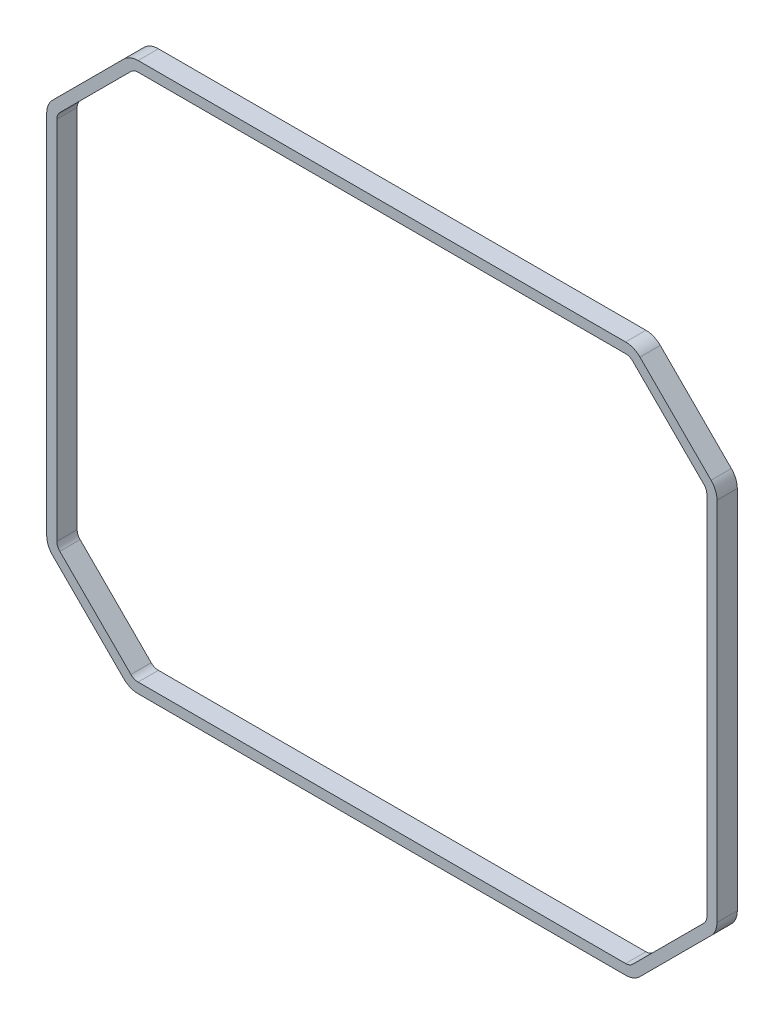
ISO-10303-21;
HEADER;
FILE_DESCRIPTION(('STEP AP214'),'2;1');
FILE_NAME('part.step','',(''),(''),'','','');
FILE_SCHEMA(('AUTOMOTIVE_DESIGN { 1 0 10303 214 1 1 1 1 }'));
ENDSEC;
DATA;
#1=APPLICATION_CONTEXT('core data for automotive mechanical design processes');
#2=APPLICATION_PROTOCOL_DEFINITION('international standard','automotive_design',2000,#1);
#3=PRODUCT_CONTEXT('',#1,'mechanical');
#4=PRODUCT('Part','Part','',(#3));
#5=PRODUCT_RELATED_PRODUCT_CATEGORY('part','',(#4));
#6=PRODUCT_DEFINITION_FORMATION('','',#4);
#7=PRODUCT_DEFINITION_CONTEXT('part definition',#1,'design');
#8=PRODUCT_DEFINITION('design','',#6,#7);
#9=PRODUCT_DEFINITION_SHAPE('','',#8);
#10=(LENGTH_UNIT() NAMED_UNIT(*) SI_UNIT(.MILLI.,.METRE.));
#11=(NAMED_UNIT(*) PLANE_ANGLE_UNIT() SI_UNIT($,.RADIAN.));
#12=(NAMED_UNIT(*) SI_UNIT($,.STERADIAN.) SOLID_ANGLE_UNIT());
#13=UNCERTAINTY_MEASURE_WITH_UNIT(LENGTH_MEASURE(1.E-05),#10,'distance_accuracy_value','');
#14=(GEOMETRIC_REPRESENTATION_CONTEXT(3) GLOBAL_UNCERTAINTY_ASSIGNED_CONTEXT((#13)) GLOBAL_UNIT_ASSIGNED_CONTEXT((#10,
#11,#12)) REPRESENTATION_CONTEXT('',''));
#15=CARTESIAN_POINT('',(0.,0.,0.));
#16=DIRECTION('',(0.,0.,1.));
#17=DIRECTION('',(1.,0.,0.));
#18=AXIS2_PLACEMENT_3D('',#15,#16,#17);
#19=CARTESIAN_POINT('',(-31.,-18.0015728752538,2.));
#20=DIRECTION('',(0.,0.,-1.));
#21=DIRECTION('',(-1.,0.,0.));
#22=AXIS2_PLACEMENT_3D('',#19,#20,#21);
#23=PLANE('',#22);
#24=CARTESIAN_POINT('',(-31.,-18.0015728752538,2.));
#25=DIRECTION('',(0.,0.,1.));
#26=DIRECTION('',(-1.,0.,0.));
#27=AXIS2_PLACEMENT_3D('',#24,#25,#26);
#28=CIRCLE('',#27,2.);
#29=CARTESIAN_POINT('',(-33.,-18.0015728752538,2.));
#30=VERTEX_POINT('',#29);
#31=CARTESIAN_POINT('',(-32.4142135623731,-19.4157864376269,2.));
#32=VERTEX_POINT('',#31);
#33=EDGE_CURVE('E363',#30,#32,#28,.T.);
#34=ORIENTED_EDGE('',*,*,#33,.T.);
#35=DIRECTION('',(0.707106781186548,-0.707106781186546,0.));
#36=VECTOR('',#35,1.);
#37=CARTESIAN_POINT('',(-32.4142135623731,-19.4157864376269,2.));
#38=LINE('',#37,#36);
#39=CARTESIAN_POINT('',(-25.4157864376269,-26.4142135623731,2.));
#40=VERTEX_POINT('',#39);
#41=EDGE_CURVE('E366',#32,#40,#38,.T.);
#42=ORIENTED_EDGE('',*,*,#41,.T.);
#43=CARTESIAN_POINT('',(-24.0015728752538,-25.,2.));
#44=DIRECTION('',(0.,0.,1.));
#45=DIRECTION('',(1.,0.,0.));
#46=AXIS2_PLACEMENT_3D('',#43,#44,#45);
#47=CIRCLE('',#46,2.);
#48=CARTESIAN_POINT('',(-24.0015728752538,-27.,2.));
#49=VERTEX_POINT('',#48);
#50=EDGE_CURVE('E369',#40,#49,#47,.T.);
#51=ORIENTED_EDGE('',*,*,#50,.T.);
#52=DIRECTION('',(1.,0.,0.));
#53=VECTOR('',#52,1.);
#54=CARTESIAN_POINT('',(-24.0015728752538,-27.,2.));
#55=LINE('',#54,#53);
#56=CARTESIAN_POINT('',(24.0015728752538,-27.,2.));
#57=VERTEX_POINT('',#56);
#58=EDGE_CURVE('E371',#49,#57,#55,.T.);
#59=ORIENTED_EDGE('',*,*,#58,.T.);
#60=CARTESIAN_POINT('',(24.0015728752538,-25.,2.));
#61=DIRECTION('',(0.,0.,1.));
#62=DIRECTION('',(-1.,0.,0.));
#63=AXIS2_PLACEMENT_3D('',#60,#61,#62);
#64=CIRCLE('',#63,2.);
#65=CARTESIAN_POINT('',(25.4157864376269,-26.4142135623731,2.));
#66=VERTEX_POINT('',#65);
#67=EDGE_CURVE('E373',#57,#66,#64,.T.);
#68=ORIENTED_EDGE('',*,*,#67,.T.);
#69=DIRECTION('',(0.707106781186548,0.707106781186547,0.));
#70=VECTOR('',#69,1.);
#71=CARTESIAN_POINT('',(25.4157864376269,-26.4142135623731,2.));
#72=LINE('',#71,#70);
#73=CARTESIAN_POINT('',(32.4142135623731,-19.4157864376269,2.));
#74=VERTEX_POINT('',#73);
#75=EDGE_CURVE('E375',#66,#74,#72,.T.);
#76=ORIENTED_EDGE('',*,*,#75,.T.);
#77=CARTESIAN_POINT('',(31.,-18.0015728752538,2.));
#78=DIRECTION('',(0.,0.,1.));
#79=DIRECTION('',(1.,0.,0.));
#80=AXIS2_PLACEMENT_3D('',#77,#78,#79);
#81=CIRCLE('',#80,2.);
#82=CARTESIAN_POINT('',(33.,-18.0015728752538,2.));
#83=VERTEX_POINT('',#82);
#84=EDGE_CURVE('E377',#74,#83,#81,.T.);
#85=ORIENTED_EDGE('',*,*,#84,.T.);
#86=DIRECTION('',(0.,1.,0.));
#87=VECTOR('',#86,1.);
#88=CARTESIAN_POINT('',(33.,-18.0015728752538,2.));
#89=LINE('',#88,#87);
#90=CARTESIAN_POINT('',(33.,18.0015728752538,2.));
#91=VERTEX_POINT('',#90);
#92=EDGE_CURVE('E379',#83,#91,#89,.T.);
#93=ORIENTED_EDGE('',*,*,#92,.T.);
#94=CARTESIAN_POINT('',(31.,18.0015728752538,2.));
#95=DIRECTION('',(0.,0.,1.));
#96=DIRECTION('',(-1.,0.,0.));
#97=AXIS2_PLACEMENT_3D('',#94,#95,#96);
#98=CIRCLE('',#97,2.);
#99=CARTESIAN_POINT('',(32.4142135623731,19.4157864376269,2.));
#100=VERTEX_POINT('',#99);
#101=EDGE_CURVE('E381',#91,#100,#98,.T.);
#102=ORIENTED_EDGE('',*,*,#101,.T.);
#103=DIRECTION('',(-0.707106781186548,0.707106781186547,0.));
#104=VECTOR('',#103,1.);
#105=CARTESIAN_POINT('',(32.4142135623731,19.4157864376269,2.));
#106=LINE('',#105,#104);
#107=CARTESIAN_POINT('',(25.4157864376269,26.4142135623731,2.));
#108=VERTEX_POINT('',#107);
#109=EDGE_CURVE('E383',#100,#108,#106,.T.);
#110=ORIENTED_EDGE('',*,*,#109,.T.);
#111=CARTESIAN_POINT('',(24.0015728752538,25.,2.));
#112=DIRECTION('',(0.,0.,1.));
#113=DIRECTION('',(1.,0.,0.));
#114=AXIS2_PLACEMENT_3D('',#111,#112,#113);
#115=CIRCLE('',#114,2.);
#116=CARTESIAN_POINT('',(24.0015728752538,27.,2.));
#117=VERTEX_POINT('',#116);
#118=EDGE_CURVE('E385',#108,#117,#115,.T.);
#119=ORIENTED_EDGE('',*,*,#118,.T.);
#120=DIRECTION('',(-1.,0.,0.));
#121=VECTOR('',#120,1.);
#122=CARTESIAN_POINT('',(24.0015728752538,27.,2.));
#123=LINE('',#122,#121);
#124=CARTESIAN_POINT('',(-24.0015728752538,27.,2.));
#125=VERTEX_POINT('',#124);
#126=EDGE_CURVE('E387',#117,#125,#123,.T.);
#127=ORIENTED_EDGE('',*,*,#126,.T.);
#128=CARTESIAN_POINT('',(-24.0015728752538,25.,2.));
#129=DIRECTION('',(0.,0.,1.));
#130=DIRECTION('',(-1.,0.,0.));
#131=AXIS2_PLACEMENT_3D('',#128,#129,#130);
#132=CIRCLE('',#131,2.);
#133=CARTESIAN_POINT('',(-25.4157864376269,26.4142135623731,2.));
#134=VERTEX_POINT('',#133);
#135=EDGE_CURVE('E389',#125,#134,#132,.T.);
#136=ORIENTED_EDGE('',*,*,#135,.T.);
#137=DIRECTION('',(-0.707106781186548,-0.707106781186547,0.));
#138=VECTOR('',#137,1.);
#139=CARTESIAN_POINT('',(-25.4157864376269,26.4142135623731,2.));
#140=LINE('',#139,#138);
#141=CARTESIAN_POINT('',(-32.4142135623731,19.4157864376269,2.));
#142=VERTEX_POINT('',#141);
#143=EDGE_CURVE('E391',#134,#142,#140,.T.);
#144=ORIENTED_EDGE('',*,*,#143,.T.);
#145=CARTESIAN_POINT('',(-31.,18.0015728752538,2.));
#146=DIRECTION('',(0.,0.,1.));
#147=DIRECTION('',(1.,0.,0.));
#148=AXIS2_PLACEMENT_3D('',#145,#146,#147);
#149=CIRCLE('',#148,2.00000000000001);
#150=CARTESIAN_POINT('',(-33.,18.0015728752538,2.));
#151=VERTEX_POINT('',#150);
#152=EDGE_CURVE('E393',#142,#151,#149,.T.);
#153=ORIENTED_EDGE('',*,*,#152,.T.);
#154=DIRECTION('',(0.,-1.,0.));
#155=VECTOR('',#154,1.);
#156=CARTESIAN_POINT('',(-33.,18.0015728752538,2.));
#157=LINE('',#156,#155);
#158=EDGE_CURVE('E395',#151,#30,#157,.T.);
#159=ORIENTED_EDGE('',*,*,#158,.T.);
#160=EDGE_LOOP('',(#34,#42,#51,#59,#68,#76,#85,#93,#102,#110,#119,#127,#136,#144,#153,#159));
#161=FACE_BOUND('',#160,.T.);
#162=CARTESIAN_POINT('',(24.0015728752538,25.,2.));
#163=DIRECTION('',(0.,0.,1.));
#164=DIRECTION('',(1.,0.,0.));
#165=AXIS2_PLACEMENT_3D('',#162,#163,#164);
#166=CIRCLE('',#165,1.);
#167=CARTESIAN_POINT('',(24.7086796564403,25.7071067811866,2.));
#168=VERTEX_POINT('',#167);
#169=CARTESIAN_POINT('',(24.0015728752538,26.,2.));
#170=VERTEX_POINT('',#169);
#171=EDGE_CURVE('E242',#168,#170,#166,.T.);
#172=ORIENTED_EDGE('',*,*,#171,.F.);
#173=DIRECTION('',(-0.707106781186548,0.707106781186547,0.));
#174=VECTOR('',#173,1.);
#175=CARTESIAN_POINT('',(31.7071067811865,18.7086796564404,2.));
#176=LINE('',#175,#174);
#177=CARTESIAN_POINT('',(31.7071067811865,18.7086796564404,2.));
#178=VERTEX_POINT('',#177);
#179=EDGE_CURVE('E291',#178,#168,#176,.T.);
#180=ORIENTED_EDGE('',*,*,#179,.F.);
#181=CARTESIAN_POINT('',(31.,18.0015728752538,2.));
#182=DIRECTION('',(0.,0.,1.));
#183=DIRECTION('',(-1.,0.,0.));
#184=AXIS2_PLACEMENT_3D('',#181,#182,#183);
#185=CIRCLE('',#184,1.);
#186=CARTESIAN_POINT('',(32.,18.0015728752538,2.));
#187=VERTEX_POINT('',#186);
#188=EDGE_CURVE('E289',#187,#178,#185,.T.);
#189=ORIENTED_EDGE('',*,*,#188,.F.);
#190=DIRECTION('',(0.,1.,0.));
#191=VECTOR('',#190,1.);
#192=CARTESIAN_POINT('',(32.,-18.0015728752538,2.));
#193=LINE('',#192,#191);
#194=CARTESIAN_POINT('',(32.,-18.0015728752538,2.));
#195=VERTEX_POINT('',#194);
#196=EDGE_CURVE('E287',#195,#187,#193,.T.);
#197=ORIENTED_EDGE('',*,*,#196,.F.);
#198=CARTESIAN_POINT('',(31.,-18.0015728752538,2.));
#199=DIRECTION('',(0.,0.,1.));
#200=DIRECTION('',(1.,0.,0.));
#201=AXIS2_PLACEMENT_3D('',#198,#199,#200);
#202=CIRCLE('',#201,0.999999999999996);
#203=CARTESIAN_POINT('',(31.7071067811865,-18.7086796564404,2.));
#204=VERTEX_POINT('',#203);
#205=EDGE_CURVE('E285',#204,#195,#202,.T.);
#206=ORIENTED_EDGE('',*,*,#205,.F.);
#207=DIRECTION('',(0.707106781186547,0.707106781186548,0.));
#208=VECTOR('',#207,1.);
#209=CARTESIAN_POINT('',(24.7086796564403,-25.7071067811866,2.));
#210=LINE('',#209,#208);
#211=CARTESIAN_POINT('',(24.7086796564403,-25.7071067811866,2.));
#212=VERTEX_POINT('',#211);
#213=EDGE_CURVE('E283',#212,#204,#210,.T.);
#214=ORIENTED_EDGE('',*,*,#213,.F.);
#215=CARTESIAN_POINT('',(24.0015728752538,-25.,2.));
#216=DIRECTION('',(0.,0.,1.));
#217=DIRECTION('',(-1.,0.,0.));
#218=AXIS2_PLACEMENT_3D('',#215,#216,#217);
#219=CIRCLE('',#218,1.);
#220=CARTESIAN_POINT('',(24.0015728752538,-26.,2.));
#221=VERTEX_POINT('',#220);
#222=EDGE_CURVE('E281',#221,#212,#219,.T.);
#223=ORIENTED_EDGE('',*,*,#222,.F.);
#224=DIRECTION('',(1.,0.,0.));
#225=VECTOR('',#224,1.);
#226=CARTESIAN_POINT('',(-24.0015728752538,-26.,2.));
#227=LINE('',#226,#225);
#228=CARTESIAN_POINT('',(-24.0015728752538,-26.,2.));
#229=VERTEX_POINT('',#228);
#230=EDGE_CURVE('E279',#229,#221,#227,.T.);
#231=ORIENTED_EDGE('',*,*,#230,.F.);
#232=CARTESIAN_POINT('',(-24.0015728752538,-25.,2.));
#233=DIRECTION('',(0.,0.,1.));
#234=DIRECTION('',(1.,0.,0.));
#235=AXIS2_PLACEMENT_3D('',#232,#233,#234);
#236=CIRCLE('',#235,1.);
#237=CARTESIAN_POINT('',(-24.7086796564403,-25.7071067811865,2.));
#238=VERTEX_POINT('',#237);
#239=EDGE_CURVE('E277',#238,#229,#236,.T.);
#240=ORIENTED_EDGE('',*,*,#239,.F.);
#241=DIRECTION('',(0.707106781186548,-0.707106781186547,0.));
#242=VECTOR('',#241,1.);
#243=CARTESIAN_POINT('',(-31.7071067811865,-18.7086796564404,2.));
#244=LINE('',#243,#242);
#245=CARTESIAN_POINT('',(-31.7071067811865,-18.7086796564404,2.));
#246=VERTEX_POINT('',#245);
#247=EDGE_CURVE('E275',#246,#238,#244,.T.);
#248=ORIENTED_EDGE('',*,*,#247,.F.);
#249=CARTESIAN_POINT('',(-31.,-18.0015728752538,2.));
#250=DIRECTION('',(0.,0.,1.));
#251=DIRECTION('',(-1.,0.,0.));
#252=AXIS2_PLACEMENT_3D('',#249,#250,#251);
#253=CIRCLE('',#252,0.999999999999998);
#254=CARTESIAN_POINT('',(-32.,-18.0015728752538,2.));
#255=VERTEX_POINT('',#254);
#256=EDGE_CURVE('E273',#255,#246,#253,.T.);
#257=ORIENTED_EDGE('',*,*,#256,.F.);
#258=DIRECTION('',(0.,-1.,0.));
#259=VECTOR('',#258,1.);
#260=CARTESIAN_POINT('',(-32.,18.0015728752538,2.));
#261=LINE('',#260,#259);
#262=CARTESIAN_POINT('',(-32.,18.0015728752538,2.));
#263=VERTEX_POINT('',#262);
#264=EDGE_CURVE('E271',#263,#255,#261,.T.);
#265=ORIENTED_EDGE('',*,*,#264,.F.);
#266=CARTESIAN_POINT('',(-31.,18.0015728752538,2.));
#267=DIRECTION('',(0.,0.,1.));
#268=DIRECTION('',(1.,0.,0.));
#269=AXIS2_PLACEMENT_3D('',#266,#267,#268);
#270=CIRCLE('',#269,1.);
#271=CARTESIAN_POINT('',(-31.7071067811865,18.7086796564404,2.));
#272=VERTEX_POINT('',#271);
#273=EDGE_CURVE('E269',#272,#263,#270,.T.);
#274=ORIENTED_EDGE('',*,*,#273,.F.);
#275=DIRECTION('',(-0.707106781186548,-0.707106781186547,0.));
#276=VECTOR('',#275,1.);
#277=CARTESIAN_POINT('',(-24.7086796564403,25.7071067811865,2.));
#278=LINE('',#277,#276);
#279=CARTESIAN_POINT('',(-24.7086796564403,25.7071067811865,2.));
#280=VERTEX_POINT('',#279);
#281=EDGE_CURVE('E265',#280,#272,#278,.T.);
#282=ORIENTED_EDGE('',*,*,#281,.F.);
#283=CARTESIAN_POINT('',(-24.0015728752538,25.,2.));
#284=DIRECTION('',(0.,0.,1.));
#285=DIRECTION('',(-1.,0.,0.));
#286=AXIS2_PLACEMENT_3D('',#283,#284,#285);
#287=CIRCLE('',#286,1.);
#288=CARTESIAN_POINT('',(-24.0015728752538,26.,2.));
#289=VERTEX_POINT('',#288);
#290=EDGE_CURVE('E263',#289,#280,#287,.T.);
#291=ORIENTED_EDGE('',*,*,#290,.F.);
#292=DIRECTION('',(-1.,0.,0.));
#293=VECTOR('',#292,1.);
#294=CARTESIAN_POINT('',(24.0015728752538,26.,2.));
#295=LINE('',#294,#293);
#296=EDGE_CURVE('E250',#170,#289,#295,.T.);
#297=ORIENTED_EDGE('',*,*,#296,.F.);
#298=EDGE_LOOP('',(#172,#180,#189,#197,#206,#214,#223,#231,#240,#248,#257,#265,#274,#282,#291,#297));
#299=FACE_BOUND('',#298,.T.);
#300=ADVANCED_FACE('F33',(#161,#299),#23,.F.);
#301=CARTESIAN_POINT('',(-31.,-18.0015728752538,0.));
#302=DIRECTION('',(0.,0.,-1.));
#303=DIRECTION('',(-1.,0.,0.));
#304=AXIS2_PLACEMENT_3D('',#301,#302,#303);
#305=PLANE('',#304);
#306=CARTESIAN_POINT('',(-31.,-18.0015728752538,0.));
#307=DIRECTION('',(0.,0.,1.));
#308=DIRECTION('',(-1.,0.,0.));
#309=AXIS2_PLACEMENT_3D('',#306,#307,#308);
#310=CIRCLE('',#309,2.);
#311=CARTESIAN_POINT('',(-33.,-18.0015728752538,0.));
#312=VERTEX_POINT('',#311);
#313=CARTESIAN_POINT('',(-32.4142135623731,-19.4157864376269,0.));
#314=VERTEX_POINT('',#313);
#315=EDGE_CURVE('E258',#312,#314,#310,.T.);
#316=ORIENTED_EDGE('',*,*,#315,.F.);
#317=DIRECTION('',(0.,-1.,0.));
#318=VECTOR('',#317,1.);
#319=CARTESIAN_POINT('',(-33.,18.0015728752538,0.));
#320=LINE('',#319,#318);
#321=CARTESIAN_POINT('',(-33.,18.0015728752538,0.));
#322=VERTEX_POINT('',#321);
#323=EDGE_CURVE('E367',#322,#312,#320,.T.);
#324=ORIENTED_EDGE('',*,*,#323,.F.);
#325=CARTESIAN_POINT('',(-31.,18.0015728752538,0.));
#326=DIRECTION('',(0.,0.,1.));
#327=DIRECTION('',(1.,0.,0.));
#328=AXIS2_PLACEMENT_3D('',#325,#326,#327);
#329=CIRCLE('',#328,2.00000000000001);
#330=CARTESIAN_POINT('',(-32.4142135623731,19.4157864376269,0.));
#331=VERTEX_POINT('',#330);
#332=EDGE_CURVE('E426',#331,#322,#329,.T.);
#333=ORIENTED_EDGE('',*,*,#332,.F.);
#334=DIRECTION('',(-0.707106781186548,-0.707106781186547,0.));
#335=VECTOR('',#334,1.);
#336=CARTESIAN_POINT('',(-25.4157864376269,26.4142135623731,0.));
#337=LINE('',#336,#335);
#338=CARTESIAN_POINT('',(-25.4157864376269,26.4142135623731,0.));
#339=VERTEX_POINT('',#338);
#340=EDGE_CURVE('E424',#339,#331,#337,.T.);
#341=ORIENTED_EDGE('',*,*,#340,.F.);
#342=CARTESIAN_POINT('',(-24.0015728752538,25.,0.));
#343=DIRECTION('',(0.,0.,1.));
#344=DIRECTION('',(-1.,0.,0.));
#345=AXIS2_PLACEMENT_3D('',#342,#343,#344);
#346=CIRCLE('',#345,2.);
#347=CARTESIAN_POINT('',(-24.0015728752538,27.,0.));
#348=VERTEX_POINT('',#347);
#349=EDGE_CURVE('E422',#348,#339,#346,.T.);
#350=ORIENTED_EDGE('',*,*,#349,.F.);
#351=DIRECTION('',(-1.,0.,0.));
#352=VECTOR('',#351,1.);
#353=CARTESIAN_POINT('',(24.0015728752538,27.,0.));
#354=LINE('',#353,#352);
#355=CARTESIAN_POINT('',(24.0015728752538,27.,0.));
#356=VERTEX_POINT('',#355);
#357=EDGE_CURVE('E420',#356,#348,#354,.T.);
#358=ORIENTED_EDGE('',*,*,#357,.F.);
#359=CARTESIAN_POINT('',(24.0015728752538,25.,0.));
#360=DIRECTION('',(0.,0.,1.));
#361=DIRECTION('',(1.,0.,0.));
#362=AXIS2_PLACEMENT_3D('',#359,#360,#361);
#363=CIRCLE('',#362,2.);
#364=CARTESIAN_POINT('',(25.4157864376269,26.4142135623731,0.));
#365=VERTEX_POINT('',#364);
#366=EDGE_CURVE('E418',#365,#356,#363,.T.);
#367=ORIENTED_EDGE('',*,*,#366,.F.);
#368=DIRECTION('',(-0.707106781186548,0.707106781186547,0.));
#369=VECTOR('',#368,1.);
#370=CARTESIAN_POINT('',(32.4142135623731,19.4157864376269,0.));
#371=LINE('',#370,#369);
#372=CARTESIAN_POINT('',(32.4142135623731,19.4157864376269,0.));
#373=VERTEX_POINT('',#372);
#374=EDGE_CURVE('E416',#373,#365,#371,.T.);
#375=ORIENTED_EDGE('',*,*,#374,.F.);
#376=CARTESIAN_POINT('',(31.,18.0015728752538,0.));
#377=DIRECTION('',(0.,0.,1.));
#378=DIRECTION('',(-1.,0.,0.));
#379=AXIS2_PLACEMENT_3D('',#376,#377,#378);
#380=CIRCLE('',#379,2.);
#381=CARTESIAN_POINT('',(33.,18.0015728752538,0.));
#382=VERTEX_POINT('',#381);
#383=EDGE_CURVE('E414',#382,#373,#380,.T.);
#384=ORIENTED_EDGE('',*,*,#383,.F.);
#385=DIRECTION('',(0.,1.,0.));
#386=VECTOR('',#385,1.);
#387=CARTESIAN_POINT('',(33.,-18.0015728752538,0.));
#388=LINE('',#387,#386);
#389=CARTESIAN_POINT('',(33.,-18.0015728752538,0.));
#390=VERTEX_POINT('',#389);
#391=EDGE_CURVE('E412',#390,#382,#388,.T.);
#392=ORIENTED_EDGE('',*,*,#391,.F.);
#393=CARTESIAN_POINT('',(31.,-18.0015728752538,0.));
#394=DIRECTION('',(0.,0.,1.));
#395=DIRECTION('',(1.,0.,0.));
#396=AXIS2_PLACEMENT_3D('',#393,#394,#395);
#397=CIRCLE('',#396,2.);
#398=CARTESIAN_POINT('',(32.4142135623731,-19.4157864376269,0.));
#399=VERTEX_POINT('',#398);
#400=EDGE_CURVE('E410',#399,#390,#397,.T.);
#401=ORIENTED_EDGE('',*,*,#400,.F.);
#402=DIRECTION('',(0.707106781186548,0.707106781186547,0.));
#403=VECTOR('',#402,1.);
#404=CARTESIAN_POINT('',(25.4157864376269,-26.4142135623731,0.));
#405=LINE('',#404,#403);
#406=CARTESIAN_POINT('',(25.4157864376269,-26.4142135623731,0.));
#407=VERTEX_POINT('',#406);
#408=EDGE_CURVE('E408',#407,#399,#405,.T.);
#409=ORIENTED_EDGE('',*,*,#408,.F.);
#410=CARTESIAN_POINT('',(24.0015728752538,-25.,0.));
#411=DIRECTION('',(0.,0.,1.));
#412=DIRECTION('',(-1.,0.,0.));
#413=AXIS2_PLACEMENT_3D('',#410,#411,#412);
#414=CIRCLE('',#413,2.);
#415=CARTESIAN_POINT('',(24.0015728752538,-27.,0.));
#416=VERTEX_POINT('',#415);
#417=EDGE_CURVE('E406',#416,#407,#414,.T.);
#418=ORIENTED_EDGE('',*,*,#417,.F.);
#419=DIRECTION('',(1.,0.,0.));
#420=VECTOR('',#419,1.);
#421=CARTESIAN_POINT('',(-24.0015728752538,-27.,0.));
#422=LINE('',#421,#420);
#423=CARTESIAN_POINT('',(-24.0015728752538,-27.,0.));
#424=VERTEX_POINT('',#423);
#425=EDGE_CURVE('E404',#424,#416,#422,.T.);
#426=ORIENTED_EDGE('',*,*,#425,.F.);
#427=CARTESIAN_POINT('',(-24.0015728752538,-25.,0.));
#428=DIRECTION('',(0.,0.,1.));
#429=DIRECTION('',(1.,0.,0.));
#430=AXIS2_PLACEMENT_3D('',#427,#428,#429);
#431=CIRCLE('',#430,2.);
#432=CARTESIAN_POINT('',(-25.4157864376269,-26.4142135623731,0.));
#433=VERTEX_POINT('',#432);
#434=EDGE_CURVE('E402',#433,#424,#431,.T.);
#435=ORIENTED_EDGE('',*,*,#434,.F.);
#436=DIRECTION('',(0.707106781186548,-0.707106781186546,0.));
#437=VECTOR('',#436,1.);
#438=CARTESIAN_POINT('',(-32.4142135623731,-19.4157864376269,0.));
#439=LINE('',#438,#437);
#440=EDGE_CURVE('E400',#314,#433,#439,.T.);
#441=ORIENTED_EDGE('',*,*,#440,.F.);
#442=EDGE_LOOP('',(#316,#324,#333,#341,#350,#358,#367,#375,#384,#392,#401,#409,#418,#426,#435,#441));
#443=FACE_BOUND('',#442,.T.);
#444=DIRECTION('',(-0.707106781186548,0.707106781186547,0.));
#445=VECTOR('',#444,1.);
#446=CARTESIAN_POINT('',(31.7071067811865,18.7086796564404,0.));
#447=LINE('',#446,#445);
#448=CARTESIAN_POINT('',(31.7071067811865,18.7086796564404,0.));
#449=VERTEX_POINT('',#448);
#450=CARTESIAN_POINT('',(24.7086796564403,25.7071067811866,0.));
#451=VERTEX_POINT('',#450);
#452=EDGE_CURVE('E251',#449,#451,#447,.T.);
#453=ORIENTED_EDGE('',*,*,#452,.T.);
#454=CARTESIAN_POINT('',(24.0015728752538,25.,0.));
#455=DIRECTION('',(0.,0.,1.));
#456=DIRECTION('',(1.,0.,0.));
#457=AXIS2_PLACEMENT_3D('',#454,#455,#456);
#458=CIRCLE('',#457,1.);
#459=CARTESIAN_POINT('',(24.0015728752538,26.,0.));
#460=VERTEX_POINT('',#459);
#461=EDGE_CURVE('E56',#451,#460,#458,.T.);
#462=ORIENTED_EDGE('',*,*,#461,.T.);
#463=DIRECTION('',(-1.,0.,0.));
#464=VECTOR('',#463,1.);
#465=CARTESIAN_POINT('',(24.0015728752538,26.,0.));
#466=LINE('',#465,#464);
#467=CARTESIAN_POINT('',(-24.0015728752538,26.,0.));
#468=VERTEX_POINT('',#467);
#469=EDGE_CURVE('E257',#460,#468,#466,.T.);
#470=ORIENTED_EDGE('',*,*,#469,.T.);
#471=CARTESIAN_POINT('',(-24.0015728752538,25.,0.));
#472=DIRECTION('',(0.,0.,1.));
#473=DIRECTION('',(-1.,0.,0.));
#474=AXIS2_PLACEMENT_3D('',#471,#472,#473);
#475=CIRCLE('',#474,1.);
#476=CARTESIAN_POINT('',(-24.7086796564403,25.7071067811865,0.));
#477=VERTEX_POINT('',#476);
#478=EDGE_CURVE('E295',#468,#477,#475,.T.);
#479=ORIENTED_EDGE('',*,*,#478,.T.);
#480=DIRECTION('',(-0.707106781186548,-0.707106781186547,0.));
#481=VECTOR('',#480,1.);
#482=CARTESIAN_POINT('',(-24.7086796564403,25.7071067811865,0.));
#483=LINE('',#482,#481);
#484=CARTESIAN_POINT('',(-31.7071067811865,18.7086796564404,0.));
#485=VERTEX_POINT('',#484);
#486=EDGE_CURVE('E298',#477,#485,#483,.T.);
#487=ORIENTED_EDGE('',*,*,#486,.T.);
#488=CARTESIAN_POINT('',(-31.,18.0015728752538,0.));
#489=DIRECTION('',(0.,0.,1.));
#490=DIRECTION('',(1.,0.,0.));
#491=AXIS2_PLACEMENT_3D('',#488,#489,#490);
#492=CIRCLE('',#491,1.);
#493=CARTESIAN_POINT('',(-32.,18.0015728752538,0.));
#494=VERTEX_POINT('',#493);
#495=EDGE_CURVE('E301',#485,#494,#492,.T.);
#496=ORIENTED_EDGE('',*,*,#495,.T.);
#497=DIRECTION('',(0.,-1.,0.));
#498=VECTOR('',#497,1.);
#499=CARTESIAN_POINT('',(-32.,18.0015728752538,0.));
#500=LINE('',#499,#498);
#501=CARTESIAN_POINT('',(-32.,-18.0015728752538,0.));
#502=VERTEX_POINT('',#501);
#503=EDGE_CURVE('E304',#494,#502,#500,.T.);
#504=ORIENTED_EDGE('',*,*,#503,.T.);
#505=CARTESIAN_POINT('',(-31.,-18.0015728752538,0.));
#506=DIRECTION('',(0.,0.,1.));
#507=DIRECTION('',(-1.,0.,0.));
#508=AXIS2_PLACEMENT_3D('',#505,#506,#507);
#509=CIRCLE('',#508,0.999999999999998);
#510=CARTESIAN_POINT('',(-31.7071067811865,-18.7086796564404,0.));
#511=VERTEX_POINT('',#510);
#512=EDGE_CURVE('E307',#502,#511,#509,.T.);
#513=ORIENTED_EDGE('',*,*,#512,.T.);
#514=DIRECTION('',(0.707106781186548,-0.707106781186547,0.));
#515=VECTOR('',#514,1.);
#516=CARTESIAN_POINT('',(-31.7071067811865,-18.7086796564404,0.));
#517=LINE('',#516,#515);
#518=CARTESIAN_POINT('',(-24.7086796564403,-25.7071067811865,0.));
#519=VERTEX_POINT('',#518);
#520=EDGE_CURVE('E310',#511,#519,#517,.T.);
#521=ORIENTED_EDGE('',*,*,#520,.T.);
#522=CARTESIAN_POINT('',(-24.0015728752538,-25.,0.));
#523=DIRECTION('',(0.,0.,1.));
#524=DIRECTION('',(1.,0.,0.));
#525=AXIS2_PLACEMENT_3D('',#522,#523,#524);
#526=CIRCLE('',#525,1.);
#527=CARTESIAN_POINT('',(-24.0015728752538,-26.,0.));
#528=VERTEX_POINT('',#527);
#529=EDGE_CURVE('E313',#519,#528,#526,.T.);
#530=ORIENTED_EDGE('',*,*,#529,.T.);
#531=DIRECTION('',(1.,0.,0.));
#532=VECTOR('',#531,1.);
#533=CARTESIAN_POINT('',(-24.0015728752538,-26.,0.));
#534=LINE('',#533,#532);
#535=CARTESIAN_POINT('',(24.0015728752538,-26.,0.));
#536=VERTEX_POINT('',#535);
#537=EDGE_CURVE('E316',#528,#536,#534,.T.);
#538=ORIENTED_EDGE('',*,*,#537,.T.);
#539=CARTESIAN_POINT('',(24.0015728752538,-25.,0.));
#540=DIRECTION('',(0.,0.,1.));
#541=DIRECTION('',(-1.,0.,0.));
#542=AXIS2_PLACEMENT_3D('',#539,#540,#541);
#543=CIRCLE('',#542,1.);
#544=CARTESIAN_POINT('',(24.7086796564403,-25.7071067811866,0.));
#545=VERTEX_POINT('',#544);
#546=EDGE_CURVE('E319',#536,#545,#543,.T.);
#547=ORIENTED_EDGE('',*,*,#546,.T.);
#548=DIRECTION('',(0.707106781186547,0.707106781186548,0.));
#549=VECTOR('',#548,1.);
#550=CARTESIAN_POINT('',(24.7086796564403,-25.7071067811866,0.));
#551=LINE('',#550,#549);
#552=CARTESIAN_POINT('',(31.7071067811865,-18.7086796564404,0.));
#553=VERTEX_POINT('',#552);
#554=EDGE_CURVE('E322',#545,#553,#551,.T.);
#555=ORIENTED_EDGE('',*,*,#554,.T.);
#556=CARTESIAN_POINT('',(31.,-18.0015728752538,0.));
#557=DIRECTION('',(0.,0.,1.));
#558=DIRECTION('',(1.,0.,0.));
#559=AXIS2_PLACEMENT_3D('',#556,#557,#558);
#560=CIRCLE('',#559,0.999999999999996);
#561=CARTESIAN_POINT('',(32.,-18.0015728752538,0.));
#562=VERTEX_POINT('',#561);
#563=EDGE_CURVE('E325',#553,#562,#560,.T.);
#564=ORIENTED_EDGE('',*,*,#563,.T.);
#565=DIRECTION('',(0.,1.,0.));
#566=VECTOR('',#565,1.);
#567=CARTESIAN_POINT('',(32.,-18.0015728752538,0.));
#568=LINE('',#567,#566);
#569=CARTESIAN_POINT('',(32.,18.0015728752538,0.));
#570=VERTEX_POINT('',#569);
#571=EDGE_CURVE('E328',#562,#570,#568,.T.);
#572=ORIENTED_EDGE('',*,*,#571,.T.);
#573=CARTESIAN_POINT('',(31.,18.0015728752538,0.));
#574=DIRECTION('',(0.,0.,1.));
#575=DIRECTION('',(-1.,0.,0.));
#576=AXIS2_PLACEMENT_3D('',#573,#574,#575);
#577=CIRCLE('',#576,1.);
#578=EDGE_CURVE('E331',#570,#449,#577,.T.);
#579=ORIENTED_EDGE('',*,*,#578,.T.);
#580=EDGE_LOOP('',(#453,#462,#470,#479,#487,#496,#504,#513,#521,#530,#538,#547,#555,#564,#572,#579));
#581=FACE_BOUND('',#580,.T.);
#582=ADVANCED_FACE('F480',(#443,#581),#305,.T.);
#583=CARTESIAN_POINT('',(-31.,-18.0015728752538,2.));
#584=DIRECTION('',(0.,0.,-1.));
#585=DIRECTION('',(-1.,0.,0.));
#586=AXIS2_PLACEMENT_3D('',#583,#584,#585);
#587=CYLINDRICAL_SURFACE('',#586,2.);
#588=ORIENTED_EDGE('',*,*,#315,.T.);
#589=DIRECTION('',(0.,0.,-1.));
#590=VECTOR('',#589,1.);
#591=CARTESIAN_POINT('',(-32.4142135623731,-19.4157864376269,2.));
#592=LINE('',#591,#590);
#593=EDGE_CURVE('E11',#32,#314,#592,.T.);
#594=ORIENTED_EDGE('',*,*,#593,.F.);
#595=ORIENTED_EDGE('',*,*,#33,.F.);
#596=DIRECTION('',(0.,0.,-1.));
#597=VECTOR('',#596,1.);
#598=CARTESIAN_POINT('',(-33.,-18.0015728752538,2.));
#599=LINE('',#598,#597);
#600=EDGE_CURVE('E397',#30,#312,#599,.T.);
#601=ORIENTED_EDGE('',*,*,#600,.T.);
#602=EDGE_LOOP('',(#588,#594,#595,#601));
#603=FACE_BOUND('',#602,.T.);
#604=ADVANCED_FACE('F35',(#603),#587,.T.);
#605=CARTESIAN_POINT('',(-32.4142135623731,-19.4157864376269,2.));
#606=DIRECTION('',(0.707106781186546,0.707106781186549,0.));
#607=DIRECTION('',(-0.707106781186549,0.707106781186546,0.));
#608=AXIS2_PLACEMENT_3D('',#605,#606,#607);
#609=PLANE('',#608);
#610=ORIENTED_EDGE('',*,*,#440,.T.);
#611=DIRECTION('',(0.,0.,-1.));
#612=VECTOR('',#611,1.);
#613=CARTESIAN_POINT('',(-25.4157864376269,-26.4142135623731,2.));
#614=LINE('',#613,#612);
#615=EDGE_CURVE('E41',#40,#433,#614,.T.);
#616=ORIENTED_EDGE('',*,*,#615,.F.);
#617=ORIENTED_EDGE('',*,*,#41,.F.);
#618=ORIENTED_EDGE('',*,*,#593,.T.);
#619=EDGE_LOOP('',(#610,#616,#617,#618));
#620=FACE_BOUND('',#619,.T.);
#621=ADVANCED_FACE('F497',(#620),#609,.F.);
#622=CARTESIAN_POINT('',(-24.0015728752538,-25.,2.));
#623=DIRECTION('',(0.,0.,-1.));
#624=DIRECTION('',(-1.,0.,0.));
#625=AXIS2_PLACEMENT_3D('',#622,#623,#624);
#626=CYLINDRICAL_SURFACE('',#625,2.);
#627=ORIENTED_EDGE('',*,*,#434,.T.);
#628=DIRECTION('',(0.,0.,-1.));
#629=VECTOR('',#628,1.);
#630=CARTESIAN_POINT('',(-24.0015728752538,-27.,2.));
#631=LINE('',#630,#629);
#632=EDGE_CURVE('E467',#49,#424,#631,.T.);
#633=ORIENTED_EDGE('',*,*,#632,.F.);
#634=ORIENTED_EDGE('',*,*,#50,.F.);
#635=ORIENTED_EDGE('',*,*,#615,.T.);
#636=EDGE_LOOP('',(#627,#633,#634,#635));
#637=FACE_BOUND('',#636,.T.);
#638=ADVANCED_FACE('F474',(#637),#626,.T.);
#639=CARTESIAN_POINT('',(-24.0015728752538,-27.,2.));
#640=DIRECTION('',(0.,1.,0.));
#641=DIRECTION('',(-1.,0.,0.));
#642=AXIS2_PLACEMENT_3D('',#639,#640,#641);
#643=PLANE('',#642);
#644=ORIENTED_EDGE('',*,*,#425,.T.);
#645=DIRECTION('',(0.,0.,-1.));
#646=VECTOR('',#645,1.);
#647=CARTESIAN_POINT('',(24.0015728752538,-27.,2.));
#648=LINE('',#647,#646);
#649=EDGE_CURVE('E464',#57,#416,#648,.T.);
#650=ORIENTED_EDGE('',*,*,#649,.F.);
#651=ORIENTED_EDGE('',*,*,#58,.F.);
#652=ORIENTED_EDGE('',*,*,#632,.T.);
#653=EDGE_LOOP('',(#644,#650,#651,#652));
#654=FACE_BOUND('',#653,.T.);
#655=ADVANCED_FACE('F486',(#654),#643,.F.);
#656=CARTESIAN_POINT('',(24.0015728752538,-25.,2.));
#657=DIRECTION('',(0.,0.,-1.));
#658=DIRECTION('',(-1.,0.,0.));
#659=AXIS2_PLACEMENT_3D('',#656,#657,#658);
#660=CYLINDRICAL_SURFACE('',#659,2.);
#661=ORIENTED_EDGE('',*,*,#417,.T.);
#662=DIRECTION('',(0.,0.,-1.));
#663=VECTOR('',#662,1.);
#664=CARTESIAN_POINT('',(25.4157864376269,-26.4142135623731,2.));
#665=LINE('',#664,#663);
#666=EDGE_CURVE('E461',#66,#407,#665,.T.);
#667=ORIENTED_EDGE('',*,*,#666,.F.);
#668=ORIENTED_EDGE('',*,*,#67,.F.);
#669=ORIENTED_EDGE('',*,*,#649,.T.);
#670=EDGE_LOOP('',(#661,#667,#668,#669));
#671=FACE_BOUND('',#670,.T.);
#672=ADVANCED_FACE('F490',(#671),#660,.T.);
#673=CARTESIAN_POINT('',(25.4157864376269,-26.4142135623731,2.));
#674=DIRECTION('',(-0.707106781186547,0.707106781186548,0.));
#675=DIRECTION('',(-0.707106781186548,-0.707106781186547,0.));
#676=AXIS2_PLACEMENT_3D('',#673,#674,#675);
#677=PLANE('',#676);
#678=ORIENTED_EDGE('',*,*,#408,.T.);
#679=DIRECTION('',(0.,0.,-1.));
#680=VECTOR('',#679,1.);
#681=CARTESIAN_POINT('',(32.4142135623731,-19.4157864376269,2.));
#682=LINE('',#681,#680);
#683=EDGE_CURVE('E458',#74,#399,#682,.T.);
#684=ORIENTED_EDGE('',*,*,#683,.F.);
#685=ORIENTED_EDGE('',*,*,#75,.F.);
#686=ORIENTED_EDGE('',*,*,#666,.T.);
#687=EDGE_LOOP('',(#678,#684,#685,#686));
#688=FACE_BOUND('',#687,.T.);
#689=ADVANCED_FACE('F550',(#688),#677,.F.);
#690=CARTESIAN_POINT('',(31.,-18.0015728752538,2.));
#691=DIRECTION('',(0.,0.,-1.));
#692=DIRECTION('',(-1.,0.,0.));
#693=AXIS2_PLACEMENT_3D('',#690,#691,#692);
#694=CYLINDRICAL_SURFACE('',#693,2.);
#695=ORIENTED_EDGE('',*,*,#400,.T.);
#696=DIRECTION('',(0.,0.,-1.));
#697=VECTOR('',#696,1.);
#698=CARTESIAN_POINT('',(33.,-18.0015728752538,2.));
#699=LINE('',#698,#697);
#700=EDGE_CURVE('E455',#83,#390,#699,.T.);
#701=ORIENTED_EDGE('',*,*,#700,.F.);
#702=ORIENTED_EDGE('',*,*,#84,.F.);
#703=ORIENTED_EDGE('',*,*,#683,.T.);
#704=EDGE_LOOP('',(#695,#701,#702,#703));
#705=FACE_BOUND('',#704,.T.);
#706=ADVANCED_FACE('F547',(#705),#694,.T.);
#707=CARTESIAN_POINT('',(33.,-18.0015728752538,2.));
#708=DIRECTION('',(-1.,0.,0.));
#709=DIRECTION('',(0.,0.,1.));
#710=AXIS2_PLACEMENT_3D('',#707,#708,#709);
#711=PLANE('',#710);
#712=ORIENTED_EDGE('',*,*,#391,.T.);
#713=DIRECTION('',(0.,0.,-1.));
#714=VECTOR('',#713,1.);
#715=CARTESIAN_POINT('',(33.,18.0015728752538,2.));
#716=LINE('',#715,#714);
#717=EDGE_CURVE('E452',#91,#382,#716,.T.);
#718=ORIENTED_EDGE('',*,*,#717,.F.);
#719=ORIENTED_EDGE('',*,*,#92,.F.);
#720=ORIENTED_EDGE('',*,*,#700,.T.);
#721=EDGE_LOOP('',(#712,#718,#719,#720));
#722=FACE_BOUND('',#721,.T.);
#723=ADVANCED_FACE('F543',(#722),#711,.F.);
#724=CARTESIAN_POINT('',(31.,18.0015728752538,2.));
#725=DIRECTION('',(0.,0.,-1.));
#726=DIRECTION('',(-1.,0.,0.));
#727=AXIS2_PLACEMENT_3D('',#724,#725,#726);
#728=CYLINDRICAL_SURFACE('',#727,2.);
#729=ORIENTED_EDGE('',*,*,#383,.T.);
#730=DIRECTION('',(0.,0.,-1.));
#731=VECTOR('',#730,1.);
#732=CARTESIAN_POINT('',(32.4142135623731,19.4157864376269,2.));
#733=LINE('',#732,#731);
#734=EDGE_CURVE('E449',#100,#373,#733,.T.);
#735=ORIENTED_EDGE('',*,*,#734,.F.);
#736=ORIENTED_EDGE('',*,*,#101,.F.);
#737=ORIENTED_EDGE('',*,*,#717,.T.);
#738=EDGE_LOOP('',(#729,#735,#736,#737));
#739=FACE_BOUND('',#738,.T.);
#740=ADVANCED_FACE('F539',(#739),#728,.T.);
#741=CARTESIAN_POINT('',(32.4142135623731,19.4157864376269,2.));
#742=DIRECTION('',(-0.707106781186547,-0.707106781186548,0.));
#743=DIRECTION('',(0.707106781186548,-0.707106781186547,0.));
#744=AXIS2_PLACEMENT_3D('',#741,#742,#743);
#745=PLANE('',#744);
#746=ORIENTED_EDGE('',*,*,#374,.T.);
#747=DIRECTION('',(0.,0.,-1.));
#748=VECTOR('',#747,1.);
#749=CARTESIAN_POINT('',(25.4157864376269,26.4142135623731,2.));
#750=LINE('',#749,#748);
#751=EDGE_CURVE('E446',#108,#365,#750,.T.);
#752=ORIENTED_EDGE('',*,*,#751,.F.);
#753=ORIENTED_EDGE('',*,*,#109,.F.);
#754=ORIENTED_EDGE('',*,*,#734,.T.);
#755=EDGE_LOOP('',(#746,#752,#753,#754));
#756=FACE_BOUND('',#755,.T.);
#757=ADVANCED_FACE('F534',(#756),#745,.F.);
#758=CARTESIAN_POINT('',(24.0015728752538,25.,2.));
#759=DIRECTION('',(0.,0.,-1.));
#760=DIRECTION('',(-1.,0.,0.));
#761=AXIS2_PLACEMENT_3D('',#758,#759,#760);
#762=CYLINDRICAL_SURFACE('',#761,2.);
#763=ORIENTED_EDGE('',*,*,#366,.T.);
#764=DIRECTION('',(0.,0.,-1.));
#765=VECTOR('',#764,1.);
#766=CARTESIAN_POINT('',(24.0015728752538,27.,2.));
#767=LINE('',#766,#765);
#768=EDGE_CURVE('E443',#117,#356,#767,.T.);
#769=ORIENTED_EDGE('',*,*,#768,.F.);
#770=ORIENTED_EDGE('',*,*,#118,.F.);
#771=ORIENTED_EDGE('',*,*,#751,.T.);
#772=EDGE_LOOP('',(#763,#769,#770,#771));
#773=FACE_BOUND('',#772,.T.);
#774=ADVANCED_FACE('F528',(#773),#762,.T.);
#775=CARTESIAN_POINT('',(24.0015728752538,27.,2.));
#776=DIRECTION('',(0.,-1.,0.));
#777=DIRECTION('',(1.,0.,0.));
#778=AXIS2_PLACEMENT_3D('',#775,#776,#777);
#779=PLANE('',#778);
#780=ORIENTED_EDGE('',*,*,#357,.T.);
#781=DIRECTION('',(0.,0.,-1.));
#782=VECTOR('',#781,1.);
#783=CARTESIAN_POINT('',(-24.0015728752538,27.,2.));
#784=LINE('',#783,#782);
#785=EDGE_CURVE('E440',#125,#348,#784,.T.);
#786=ORIENTED_EDGE('',*,*,#785,.F.);
#787=ORIENTED_EDGE('',*,*,#126,.F.);
#788=ORIENTED_EDGE('',*,*,#768,.T.);
#789=EDGE_LOOP('',(#780,#786,#787,#788));
#790=FACE_BOUND('',#789,.T.);
#791=ADVANCED_FACE('F524',(#790),#779,.F.);
#792=CARTESIAN_POINT('',(-24.0015728752538,25.,2.));
#793=DIRECTION('',(0.,0.,-1.));
#794=DIRECTION('',(-1.,0.,0.));
#795=AXIS2_PLACEMENT_3D('',#792,#793,#794);
#796=CYLINDRICAL_SURFACE('',#795,2.);
#797=ORIENTED_EDGE('',*,*,#349,.T.);
#798=DIRECTION('',(0.,0.,-1.));
#799=VECTOR('',#798,1.);
#800=CARTESIAN_POINT('',(-25.4157864376269,26.4142135623731,2.));
#801=LINE('',#800,#799);
#802=EDGE_CURVE('E437',#134,#339,#801,.T.);
#803=ORIENTED_EDGE('',*,*,#802,.F.);
#804=ORIENTED_EDGE('',*,*,#135,.F.);
#805=ORIENTED_EDGE('',*,*,#785,.T.);
#806=EDGE_LOOP('',(#797,#803,#804,#805));
#807=FACE_BOUND('',#806,.T.);
#808=ADVANCED_FACE('F519',(#807),#796,.T.);
#809=CARTESIAN_POINT('',(-25.4157864376269,26.4142135623731,2.));
#810=DIRECTION('',(0.707106781186547,-0.707106781186548,0.));
#811=DIRECTION('',(0.707106781186548,0.707106781186547,0.));
#812=AXIS2_PLACEMENT_3D('',#809,#810,#811);
#813=PLANE('',#812);
#814=ORIENTED_EDGE('',*,*,#340,.T.);
#815=DIRECTION('',(0.,0.,-1.));
#816=VECTOR('',#815,1.);
#817=CARTESIAN_POINT('',(-32.4142135623731,19.4157864376269,2.));
#818=LINE('',#817,#816);
#819=EDGE_CURVE('E434',#142,#331,#818,.T.);
#820=ORIENTED_EDGE('',*,*,#819,.F.);
#821=ORIENTED_EDGE('',*,*,#143,.F.);
#822=ORIENTED_EDGE('',*,*,#802,.T.);
#823=EDGE_LOOP('',(#814,#820,#821,#822));
#824=FACE_BOUND('',#823,.T.);
#825=ADVANCED_FACE('F513',(#824),#813,.F.);
#826=CARTESIAN_POINT('',(-31.,18.0015728752538,2.));
#827=DIRECTION('',(0.,0.,-1.));
#828=DIRECTION('',(-1.,0.,0.));
#829=AXIS2_PLACEMENT_3D('',#826,#827,#828);
#830=CYLINDRICAL_SURFACE('',#829,2.00000000000001);
#831=ORIENTED_EDGE('',*,*,#332,.T.);
#832=DIRECTION('',(0.,0.,-1.));
#833=VECTOR('',#832,1.);
#834=CARTESIAN_POINT('',(-33.,18.0015728752538,2.));
#835=LINE('',#834,#833);
#836=EDGE_CURVE('E431',#151,#322,#835,.T.);
#837=ORIENTED_EDGE('',*,*,#836,.F.);
#838=ORIENTED_EDGE('',*,*,#152,.F.);
#839=ORIENTED_EDGE('',*,*,#819,.T.);
#840=EDGE_LOOP('',(#831,#837,#838,#839));
#841=FACE_BOUND('',#840,.T.);
#842=ADVANCED_FACE('F509',(#841),#830,.T.);
#843=CARTESIAN_POINT('',(-33.,18.0015728752538,2.));
#844=DIRECTION('',(1.,0.,0.));
#845=DIRECTION('',(0.,1.,0.));
#846=AXIS2_PLACEMENT_3D('',#843,#844,#845);
#847=PLANE('',#846);
#848=ORIENTED_EDGE('',*,*,#323,.T.);
#849=ORIENTED_EDGE('',*,*,#600,.F.);
#850=ORIENTED_EDGE('',*,*,#158,.F.);
#851=ORIENTED_EDGE('',*,*,#836,.T.);
#852=EDGE_LOOP('',(#848,#849,#850,#851));
#853=FACE_BOUND('',#852,.T.);
#854=ADVANCED_FACE('F504',(#853),#847,.F.);
#855=CARTESIAN_POINT('',(24.0015728752538,25.,2.));
#856=DIRECTION('',(0.,0.,-1.));
#857=DIRECTION('',(-1.,0.,0.));
#858=AXIS2_PLACEMENT_3D('',#855,#856,#857);
#859=CYLINDRICAL_SURFACE('',#858,1.);
#860=ORIENTED_EDGE('',*,*,#461,.F.);
#861=DIRECTION('',(0.,0.,-1.));
#862=VECTOR('',#861,1.);
#863=CARTESIAN_POINT('',(24.7086796564403,25.7071067811866,2.));
#864=LINE('',#863,#862);
#865=EDGE_CURVE('E246',#168,#451,#864,.T.);
#866=ORIENTED_EDGE('',*,*,#865,.F.);
#867=ORIENTED_EDGE('',*,*,#171,.T.);
#868=DIRECTION('',(0.,0.,-1.));
#869=VECTOR('',#868,1.);
#870=CARTESIAN_POINT('',(24.0015728752538,26.,2.));
#871=LINE('',#870,#869);
#872=EDGE_CURVE('E245',#170,#460,#871,.T.);
#873=ORIENTED_EDGE('',*,*,#872,.T.);
#874=EDGE_LOOP('',(#860,#866,#867,#873));
#875=FACE_BOUND('',#874,.T.);
#876=ADVANCED_FACE('F244',(#875),#859,.F.);
#877=CARTESIAN_POINT('',(24.0015728752538,26.,2.));
#878=DIRECTION('',(0.,-1.,0.));
#879=DIRECTION('',(1.,0.,0.));
#880=AXIS2_PLACEMENT_3D('',#877,#878,#879);
#881=PLANE('',#880);
#882=ORIENTED_EDGE('',*,*,#469,.F.);
#883=ORIENTED_EDGE('',*,*,#872,.F.);
#884=ORIENTED_EDGE('',*,*,#296,.T.);
#885=DIRECTION('',(0.,0.,-1.));
#886=VECTOR('',#885,1.);
#887=CARTESIAN_POINT('',(-24.0015728752538,26.,2.));
#888=LINE('',#887,#886);
#889=EDGE_CURVE('E259',#289,#468,#888,.T.);
#890=ORIENTED_EDGE('',*,*,#889,.T.);
#891=EDGE_LOOP('',(#882,#883,#884,#890));
#892=FACE_BOUND('',#891,.T.);
#893=ADVANCED_FACE('F254',(#892),#881,.T.);
#894=CARTESIAN_POINT('',(-24.0015728752538,25.,2.));
#895=DIRECTION('',(0.,0.,-1.));
#896=DIRECTION('',(-1.,0.,0.));
#897=AXIS2_PLACEMENT_3D('',#894,#895,#896);
#898=CYLINDRICAL_SURFACE('',#897,1.);
#899=ORIENTED_EDGE('',*,*,#478,.F.);
#900=ORIENTED_EDGE('',*,*,#889,.F.);
#901=ORIENTED_EDGE('',*,*,#290,.T.);
#902=DIRECTION('',(0.,0.,-1.));
#903=VECTOR('',#902,1.);
#904=CARTESIAN_POINT('',(-24.7086796564403,25.7071067811865,2.));
#905=LINE('',#904,#903);
#906=EDGE_CURVE('E360',#280,#477,#905,.T.);
#907=ORIENTED_EDGE('',*,*,#906,.T.);
#908=EDGE_LOOP('',(#899,#900,#901,#907));
#909=FACE_BOUND('',#908,.T.);
#910=ADVANCED_FACE('F632',(#909),#898,.F.);
#911=CARTESIAN_POINT('',(-24.7086796564403,25.7071067811865,2.));
#912=DIRECTION('',(0.707106781186547,-0.707106781186548,0.));
#913=DIRECTION('',(0.707106781186548,0.707106781186547,0.));
#914=AXIS2_PLACEMENT_3D('',#911,#912,#913);
#915=PLANE('',#914);
#916=ORIENTED_EDGE('',*,*,#486,.F.);
#917=ORIENTED_EDGE('',*,*,#906,.F.);
#918=ORIENTED_EDGE('',*,*,#281,.T.);
#919=DIRECTION('',(0.,0.,-1.));
#920=VECTOR('',#919,1.);
#921=CARTESIAN_POINT('',(-31.7071067811865,18.7086796564404,2.));
#922=LINE('',#921,#920);
#923=EDGE_CURVE('E358',#272,#485,#922,.T.);
#924=ORIENTED_EDGE('',*,*,#923,.T.);
#925=EDGE_LOOP('',(#916,#917,#918,#924));
#926=FACE_BOUND('',#925,.T.);
#927=ADVANCED_FACE('F638',(#926),#915,.T.);
#928=CARTESIAN_POINT('',(-31.,18.0015728752538,2.));
#929=DIRECTION('',(0.,0.,-1.));
#930=DIRECTION('',(-1.,0.,0.));
#931=AXIS2_PLACEMENT_3D('',#928,#929,#930);
#932=CYLINDRICAL_SURFACE('',#931,1.);
#933=ORIENTED_EDGE('',*,*,#495,.F.);
#934=ORIENTED_EDGE('',*,*,#923,.F.);
#935=ORIENTED_EDGE('',*,*,#273,.T.);
#936=DIRECTION('',(0.,0.,-1.));
#937=VECTOR('',#936,1.);
#938=CARTESIAN_POINT('',(-32.,18.0015728752538,2.));
#939=LINE('',#938,#937);
#940=EDGE_CURVE('E356',#263,#494,#939,.T.);
#941=ORIENTED_EDGE('',*,*,#940,.T.);
#942=EDGE_LOOP('',(#933,#934,#935,#941));
#943=FACE_BOUND('',#942,.T.);
#944=ADVANCED_FACE('F646',(#943),#932,.F.);
#945=CARTESIAN_POINT('',(-32.,18.0015728752538,2.));
#946=DIRECTION('',(1.,0.,0.));
#947=DIRECTION('',(0.,1.,0.));
#948=AXIS2_PLACEMENT_3D('',#945,#946,#947);
#949=PLANE('',#948);
#950=ORIENTED_EDGE('',*,*,#503,.F.);
#951=ORIENTED_EDGE('',*,*,#940,.F.);
#952=ORIENTED_EDGE('',*,*,#264,.T.);
#953=DIRECTION('',(0.,0.,-1.));
#954=VECTOR('',#953,1.);
#955=CARTESIAN_POINT('',(-32.,-18.0015728752538,2.));
#956=LINE('',#955,#954);
#957=EDGE_CURVE('E354',#255,#502,#956,.T.);
#958=ORIENTED_EDGE('',*,*,#957,.T.);
#959=EDGE_LOOP('',(#950,#951,#952,#958));
#960=FACE_BOUND('',#959,.T.);
#961=ADVANCED_FACE('F654',(#960),#949,.T.);
#962=CARTESIAN_POINT('',(-31.,-18.0015728752538,2.));
#963=DIRECTION('',(0.,0.,-1.));
#964=DIRECTION('',(-1.,0.,0.));
#965=AXIS2_PLACEMENT_3D('',#962,#963,#964);
#966=CYLINDRICAL_SURFACE('',#965,0.999999999999998);
#967=ORIENTED_EDGE('',*,*,#512,.F.);
#968=ORIENTED_EDGE('',*,*,#957,.F.);
#969=ORIENTED_EDGE('',*,*,#256,.T.);
#970=DIRECTION('',(0.,0.,-1.));
#971=VECTOR('',#970,1.);
#972=CARTESIAN_POINT('',(-31.7071067811865,-18.7086796564404,2.));
#973=LINE('',#972,#971);
#974=EDGE_CURVE('E352',#246,#511,#973,.T.);
#975=ORIENTED_EDGE('',*,*,#974,.T.);
#976=EDGE_LOOP('',(#967,#968,#969,#975));
#977=FACE_BOUND('',#976,.T.);
#978=ADVANCED_FACE('F662',(#977),#966,.F.);
#979=CARTESIAN_POINT('',(-31.7071067811865,-18.7086796564404,2.));
#980=DIRECTION('',(0.707106781186547,0.707106781186548,0.));
#981=DIRECTION('',(-0.707106781186548,0.707106781186547,0.));
#982=AXIS2_PLACEMENT_3D('',#979,#980,#981);
#983=PLANE('',#982);
#984=ORIENTED_EDGE('',*,*,#520,.F.);
#985=ORIENTED_EDGE('',*,*,#974,.F.);
#986=ORIENTED_EDGE('',*,*,#247,.T.);
#987=DIRECTION('',(0.,0.,-1.));
#988=VECTOR('',#987,1.);
#989=CARTESIAN_POINT('',(-24.7086796564403,-25.7071067811865,2.));
#990=LINE('',#989,#988);
#991=EDGE_CURVE('E350',#238,#519,#990,.T.);
#992=ORIENTED_EDGE('',*,*,#991,.T.);
#993=EDGE_LOOP('',(#984,#985,#986,#992));
#994=FACE_BOUND('',#993,.T.);
#995=ADVANCED_FACE('F670',(#994),#983,.T.);
#996=CARTESIAN_POINT('',(-24.0015728752538,-25.,2.));
#997=DIRECTION('',(0.,0.,-1.));
#998=DIRECTION('',(-1.,0.,0.));
#999=AXIS2_PLACEMENT_3D('',#996,#997,#998);
#1000=CYLINDRICAL_SURFACE('',#999,1.);
#1001=ORIENTED_EDGE('',*,*,#529,.F.);
#1002=ORIENTED_EDGE('',*,*,#991,.F.);
#1003=ORIENTED_EDGE('',*,*,#239,.T.);
#1004=DIRECTION('',(0.,0.,-1.));
#1005=VECTOR('',#1004,1.);
#1006=CARTESIAN_POINT('',(-24.0015728752538,-26.,2.));
#1007=LINE('',#1006,#1005);
#1008=EDGE_CURVE('E348',#229,#528,#1007,.T.);
#1009=ORIENTED_EDGE('',*,*,#1008,.T.);
#1010=EDGE_LOOP('',(#1001,#1002,#1003,#1009));
#1011=FACE_BOUND('',#1010,.T.);
#1012=ADVANCED_FACE('F678',(#1011),#1000,.F.);
#1013=CARTESIAN_POINT('',(-24.0015728752538,-26.,2.));
#1014=DIRECTION('',(0.,1.,0.));
#1015=DIRECTION('',(-1.,0.,0.));
#1016=AXIS2_PLACEMENT_3D('',#1013,#1014,#1015);
#1017=PLANE('',#1016);
#1018=ORIENTED_EDGE('',*,*,#537,.F.);
#1019=ORIENTED_EDGE('',*,*,#1008,.F.);
#1020=ORIENTED_EDGE('',*,*,#230,.T.);
#1021=DIRECTION('',(0.,0.,-1.));
#1022=VECTOR('',#1021,1.);
#1023=CARTESIAN_POINT('',(24.0015728752538,-26.,2.));
#1024=LINE('',#1023,#1022);
#1025=EDGE_CURVE('E346',#221,#536,#1024,.T.);
#1026=ORIENTED_EDGE('',*,*,#1025,.T.);
#1027=EDGE_LOOP('',(#1018,#1019,#1020,#1026));
#1028=FACE_BOUND('',#1027,.T.);
#1029=ADVANCED_FACE('F686',(#1028),#1017,.T.);
#1030=CARTESIAN_POINT('',(24.0015728752538,-25.,2.));
#1031=DIRECTION('',(0.,0.,-1.));
#1032=DIRECTION('',(-1.,0.,0.));
#1033=AXIS2_PLACEMENT_3D('',#1030,#1031,#1032);
#1034=CYLINDRICAL_SURFACE('',#1033,1.);
#1035=ORIENTED_EDGE('',*,*,#546,.F.);
#1036=ORIENTED_EDGE('',*,*,#1025,.F.);
#1037=ORIENTED_EDGE('',*,*,#222,.T.);
#1038=DIRECTION('',(0.,0.,-1.));
#1039=VECTOR('',#1038,1.);
#1040=CARTESIAN_POINT('',(24.7086796564403,-25.7071067811866,2.));
#1041=LINE('',#1040,#1039);
#1042=EDGE_CURVE('E344',#212,#545,#1041,.T.);
#1043=ORIENTED_EDGE('',*,*,#1042,.T.);
#1044=EDGE_LOOP('',(#1035,#1036,#1037,#1043));
#1045=FACE_BOUND('',#1044,.T.);
#1046=ADVANCED_FACE('F694',(#1045),#1034,.F.);
#1047=CARTESIAN_POINT('',(24.7086796564403,-25.7071067811866,2.));
#1048=DIRECTION('',(-0.707106781186548,0.707106781186547,0.));
#1049=DIRECTION('',(-0.707106781186547,-0.707106781186548,0.));
#1050=AXIS2_PLACEMENT_3D('',#1047,#1048,#1049);
#1051=PLANE('',#1050);
#1052=ORIENTED_EDGE('',*,*,#554,.F.);
#1053=ORIENTED_EDGE('',*,*,#1042,.F.);
#1054=ORIENTED_EDGE('',*,*,#213,.T.);
#1055=DIRECTION('',(0.,0.,-1.));
#1056=VECTOR('',#1055,1.);
#1057=CARTESIAN_POINT('',(31.7071067811865,-18.7086796564404,2.));
#1058=LINE('',#1057,#1056);
#1059=EDGE_CURVE('E342',#204,#553,#1058,.T.);
#1060=ORIENTED_EDGE('',*,*,#1059,.T.);
#1061=EDGE_LOOP('',(#1052,#1053,#1054,#1060));
#1062=FACE_BOUND('',#1061,.T.);
#1063=ADVANCED_FACE('F702',(#1062),#1051,.T.);
#1064=CARTESIAN_POINT('',(31.,-18.0015728752538,2.));
#1065=DIRECTION('',(0.,0.,-1.));
#1066=DIRECTION('',(-1.,0.,0.));
#1067=AXIS2_PLACEMENT_3D('',#1064,#1065,#1066);
#1068=CYLINDRICAL_SURFACE('',#1067,0.999999999999996);
#1069=ORIENTED_EDGE('',*,*,#563,.F.);
#1070=ORIENTED_EDGE('',*,*,#1059,.F.);
#1071=ORIENTED_EDGE('',*,*,#205,.T.);
#1072=DIRECTION('',(0.,0.,-1.));
#1073=VECTOR('',#1072,1.);
#1074=CARTESIAN_POINT('',(32.,-18.0015728752538,2.));
#1075=LINE('',#1074,#1073);
#1076=EDGE_CURVE('E340',#195,#562,#1075,.T.);
#1077=ORIENTED_EDGE('',*,*,#1076,.T.);
#1078=EDGE_LOOP('',(#1069,#1070,#1071,#1077));
#1079=FACE_BOUND('',#1078,.T.);
#1080=ADVANCED_FACE('F710',(#1079),#1068,.F.);
#1081=CARTESIAN_POINT('',(32.,-18.0015728752538,2.));
#1082=DIRECTION('',(-1.,0.,0.));
#1083=DIRECTION('',(0.,-1.,0.));
#1084=AXIS2_PLACEMENT_3D('',#1081,#1082,#1083);
#1085=PLANE('',#1084);
#1086=ORIENTED_EDGE('',*,*,#571,.F.);
#1087=ORIENTED_EDGE('',*,*,#1076,.F.);
#1088=ORIENTED_EDGE('',*,*,#196,.T.);
#1089=DIRECTION('',(0.,0.,-1.));
#1090=VECTOR('',#1089,1.);
#1091=CARTESIAN_POINT('',(32.,18.0015728752538,2.));
#1092=LINE('',#1091,#1090);
#1093=EDGE_CURVE('E338',#187,#570,#1092,.T.);
#1094=ORIENTED_EDGE('',*,*,#1093,.T.);
#1095=EDGE_LOOP('',(#1086,#1087,#1088,#1094));
#1096=FACE_BOUND('',#1095,.T.);
#1097=ADVANCED_FACE('F718',(#1096),#1085,.T.);
#1098=CARTESIAN_POINT('',(31.,18.0015728752538,2.));
#1099=DIRECTION('',(0.,0.,-1.));
#1100=DIRECTION('',(-1.,0.,0.));
#1101=AXIS2_PLACEMENT_3D('',#1098,#1099,#1100);
#1102=CYLINDRICAL_SURFACE('',#1101,1.);
#1103=ORIENTED_EDGE('',*,*,#578,.F.);
#1104=ORIENTED_EDGE('',*,*,#1093,.F.);
#1105=ORIENTED_EDGE('',*,*,#188,.T.);
#1106=DIRECTION('',(0.,0.,-1.));
#1107=VECTOR('',#1106,1.);
#1108=CARTESIAN_POINT('',(31.7071067811865,18.7086796564404,2.));
#1109=LINE('',#1108,#1107);
#1110=EDGE_CURVE('E48',#178,#449,#1109,.T.);
#1111=ORIENTED_EDGE('',*,*,#1110,.T.);
#1112=EDGE_LOOP('',(#1103,#1104,#1105,#1111));
#1113=FACE_BOUND('',#1112,.T.);
#1114=ADVANCED_FACE('F726',(#1113),#1102,.F.);
#1115=CARTESIAN_POINT('',(31.7071067811865,18.7086796564404,2.));
#1116=DIRECTION('',(-0.707106781186547,-0.707106781186548,0.));
#1117=DIRECTION('',(0.707106781186548,-0.707106781186547,0.));
#1118=AXIS2_PLACEMENT_3D('',#1115,#1116,#1117);
#1119=PLANE('',#1118);
#1120=ORIENTED_EDGE('',*,*,#452,.F.);
#1121=ORIENTED_EDGE('',*,*,#1110,.F.);
#1122=ORIENTED_EDGE('',*,*,#179,.T.);
#1123=ORIENTED_EDGE('',*,*,#865,.T.);
#1124=EDGE_LOOP('',(#1120,#1121,#1122,#1123));
#1125=FACE_BOUND('',#1124,.T.);
#1126=ADVANCED_FACE('F734',(#1125),#1119,.T.);
#1127=CLOSED_SHELL('',(#300,#582,#604,#621,#638,#655,#672,#689,#706,#723,#740,#757,#774,#791,
#808,#825,#842,#854,#876,#893,#910,#927,#944,#961,#978,#995,#1012,#1029,#1046,#1063,#1080,#1097,
#1114,#1126));
#1128=MANIFOLD_SOLID_BREP('B2',#1127);
#1129=ADVANCED_BREP_SHAPE_REPRESENTATION('',(#18,#1128),#14);
#1130=SHAPE_DEFINITION_REPRESENTATION(#9,#1129);
ENDSEC;
END-ISO-10303-21;
